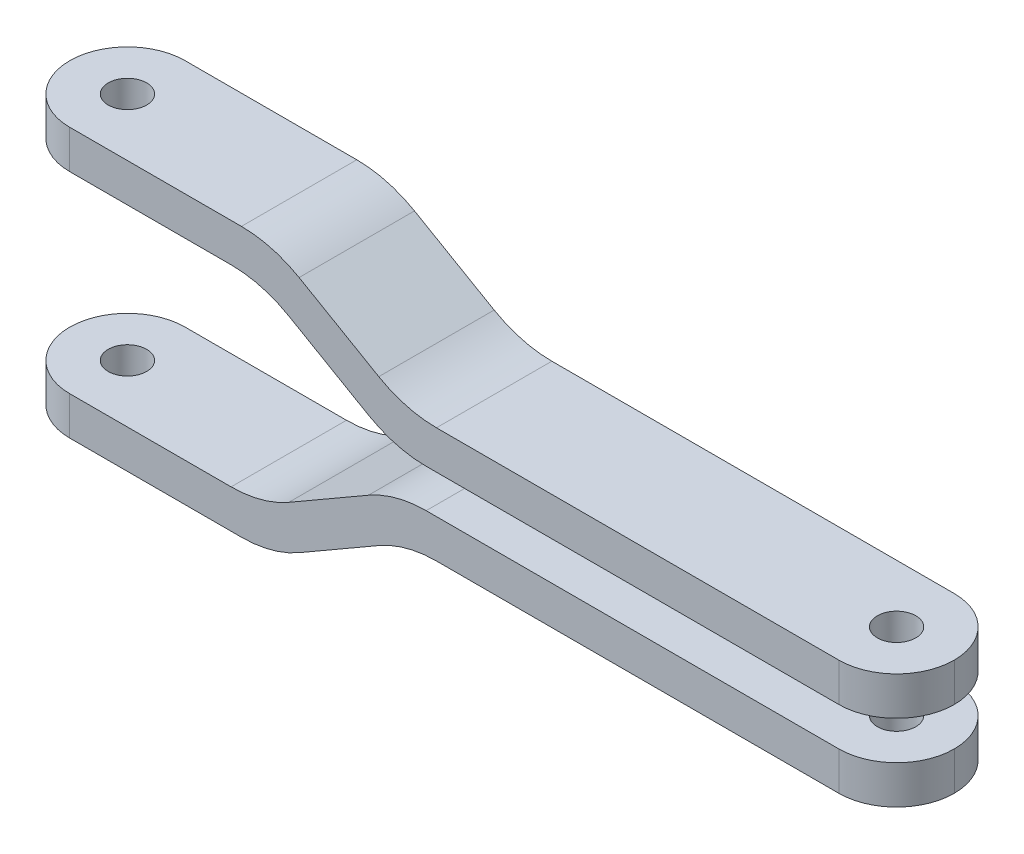
ISO-10303-21;
HEADER;
FILE_DESCRIPTION(('STEP AP214'),'2;1');
FILE_NAME('part.step','',(''),(''),'','','');
FILE_SCHEMA(('AUTOMOTIVE_DESIGN { 1 0 10303 214 1 1 1 1 }'));
ENDSEC;
DATA;
#1=APPLICATION_CONTEXT('core data for automotive mechanical design processes');
#2=APPLICATION_PROTOCOL_DEFINITION('international standard','automotive_design',2000,#1);
#3=PRODUCT_CONTEXT('',#1,'mechanical');
#4=PRODUCT('Part','Part','',(#3));
#5=PRODUCT_RELATED_PRODUCT_CATEGORY('part','',(#4));
#6=PRODUCT_DEFINITION_FORMATION('','',#4);
#7=PRODUCT_DEFINITION_CONTEXT('part definition',#1,'design');
#8=PRODUCT_DEFINITION('design','',#6,#7);
#9=PRODUCT_DEFINITION_SHAPE('','',#8);
#10=(LENGTH_UNIT() NAMED_UNIT(*) SI_UNIT(.MILLI.,.METRE.));
#11=(NAMED_UNIT(*) PLANE_ANGLE_UNIT() SI_UNIT($,.RADIAN.));
#12=(NAMED_UNIT(*) SI_UNIT($,.STERADIAN.) SOLID_ANGLE_UNIT());
#13=UNCERTAINTY_MEASURE_WITH_UNIT(LENGTH_MEASURE(1.E-05),#10,'distance_accuracy_value','');
#14=(GEOMETRIC_REPRESENTATION_CONTEXT(3) GLOBAL_UNCERTAINTY_ASSIGNED_CONTEXT((#13)) GLOBAL_UNIT_ASSIGNED_CONTEXT((#10,
#11,#12)) REPRESENTATION_CONTEXT('',''));
#15=CARTESIAN_POINT('',(0.,0.,0.));
#16=DIRECTION('',(0.,0.,1.));
#17=DIRECTION('',(1.,0.,0.));
#18=AXIS2_PLACEMENT_3D('',#15,#16,#17);
#19=CARTESIAN_POINT('',(-215.,35.,15.));
#20=DIRECTION('',(0.,-1.,0.));
#21=DIRECTION('',(-1.,0.,0.));
#22=AXIS2_PLACEMENT_3D('',#19,#20,#21);
#23=PLANE('',#22);
#24=CARTESIAN_POINT('',(-200.,35.,0.));
#25=DIRECTION('',(0.,1.,0.));
#26=DIRECTION('',(-1.,0.,0.));
#27=AXIS2_PLACEMENT_3D('',#24,#25,#26);
#28=CIRCLE('',#27,4.99999999999999);
#29=CARTESIAN_POINT('',(-205.,35.,0.));
#30=VERTEX_POINT('',#29);
#31=EDGE_CURVE('E301',#30,#30,#28,.F.);
#32=ORIENTED_EDGE('',*,*,#31,.T.);
#33=EDGE_LOOP('',(#32));
#34=FACE_BOUND('',#33,.T.);
#35=DIRECTION('',(1.,0.,0.));
#36=VECTOR('',#35,1.);
#37=CARTESIAN_POINT('',(-215.,35.,-15.));
#38=LINE('',#37,#36);
#39=CARTESIAN_POINT('',(-200.,35.,-15.));
#40=VERTEX_POINT('',#39);
#41=CARTESIAN_POINT('',(-155.358983848622,35.,-15.));
#42=VERTEX_POINT('',#41);
#43=EDGE_CURVE('E188',#40,#42,#38,.T.);
#44=ORIENTED_EDGE('',*,*,#43,.F.);
#45=CARTESIAN_POINT('',(-200.,35.,0.));
#46=DIRECTION('',(0.,1.,0.));
#47=DIRECTION('',(-1.,0.,0.));
#48=AXIS2_PLACEMENT_3D('',#45,#46,#47);
#49=CIRCLE('',#48,15.);
#50=CARTESIAN_POINT('',(-215.,35.,0.));
#51=VERTEX_POINT('',#50);
#52=EDGE_CURVE('E173',#51,#40,#49,.F.);
#53=ORIENTED_EDGE('',*,*,#52,.F.);
#54=CARTESIAN_POINT('',(-200.,35.,0.));
#55=DIRECTION('',(0.,1.,0.));
#56=DIRECTION('',(-1.,0.,0.));
#57=AXIS2_PLACEMENT_3D('',#54,#55,#56);
#58=CIRCLE('',#57,15.);
#59=CARTESIAN_POINT('',(-200.,35.,15.));
#60=VERTEX_POINT('',#59);
#61=EDGE_CURVE('E152',#60,#51,#58,.F.);
#62=ORIENTED_EDGE('',*,*,#61,.F.);
#63=DIRECTION('',(1.,0.,0.));
#64=VECTOR('',#63,1.);
#65=CARTESIAN_POINT('',(-215.,35.,15.));
#66=LINE('',#65,#64);
#67=CARTESIAN_POINT('',(-155.358983848622,35.,15.));
#68=VERTEX_POINT('',#67);
#69=EDGE_CURVE('E161',#60,#68,#66,.T.);
#70=ORIENTED_EDGE('',*,*,#69,.T.);
#71=DIRECTION('',(0.,0.,-1.));
#72=VECTOR('',#71,1.);
#73=CARTESIAN_POINT('',(-155.358983848622,35.,15.));
#74=LINE('',#73,#72);
#75=EDGE_CURVE('E204',#42,#68,#74,.F.);
#76=ORIENTED_EDGE('',*,*,#75,.F.);
#77=EDGE_LOOP('',(#44,#53,#62,#70,#76));
#78=FACE_BOUND('',#77,.T.);
#79=ADVANCED_FACE('F49',(#34,#78),#23,.F.);
#80=CARTESIAN_POINT('',(-147.320508075689,35.,15.));
#81=DIRECTION('',(-0.500000000000001,-0.866025403784438,0.));
#82=DIRECTION('',(-0.866025403784438,0.500000000000002,0.));
#83=AXIS2_PLACEMENT_3D('',#80,#81,#82);
#84=PLANE('',#83);
#85=DIRECTION('',(0.866025403784438,-0.500000000000002,0.));
#86=VECTOR('',#85,1.);
#87=CARTESIAN_POINT('',(-147.320508075689,35.,-15.));
#88=LINE('',#87,#86);
#89=CARTESIAN_POINT('',(-140.358983848622,30.9807621135332,-15.));
#90=VERTEX_POINT('',#89);
#91=CARTESIAN_POINT('',(-119.641016151378,19.0192378864669,-15.));
#92=VERTEX_POINT('',#91);
#93=EDGE_CURVE('E269',#90,#92,#88,.T.);
#94=ORIENTED_EDGE('',*,*,#93,.F.);
#95=DIRECTION('',(0.,0.,-1.));
#96=VECTOR('',#95,1.);
#97=CARTESIAN_POINT('',(-140.358983848622,30.9807621135332,15.));
#98=LINE('',#97,#96);
#99=CARTESIAN_POINT('',(-140.358983848622,30.9807621135332,15.));
#100=VERTEX_POINT('',#99);
#101=EDGE_CURVE('E194',#100,#90,#98,.T.);
#102=ORIENTED_EDGE('',*,*,#101,.F.);
#103=DIRECTION('',(0.866025403784438,-0.500000000000002,0.));
#104=VECTOR('',#103,1.);
#105=CARTESIAN_POINT('',(-147.320508075689,35.,15.));
#106=LINE('',#105,#104);
#107=CARTESIAN_POINT('',(-119.641016151378,19.0192378864669,15.));
#108=VERTEX_POINT('',#107);
#109=EDGE_CURVE('E168',#100,#108,#106,.T.);
#110=ORIENTED_EDGE('',*,*,#109,.T.);
#111=DIRECTION('',(0.,0.,-1.));
#112=VECTOR('',#111,1.);
#113=CARTESIAN_POINT('',(-119.641016151378,19.0192378864669,15.));
#114=LINE('',#113,#112);
#115=EDGE_CURVE('E197',#92,#108,#114,.F.);
#116=ORIENTED_EDGE('',*,*,#115,.F.);
#117=EDGE_LOOP('',(#94,#102,#110,#116));
#118=FACE_BOUND('',#117,.T.);
#119=ADVANCED_FACE('F318',(#118),#84,.F.);
#120=CARTESIAN_POINT('',(-112.679491924311,15.,15.));
#121=DIRECTION('',(0.,-1.,0.));
#122=DIRECTION('',(-1.,0.,0.));
#123=AXIS2_PLACEMENT_3D('',#120,#121,#122);
#124=PLANE('',#123);
#125=CARTESIAN_POINT('',(0.,15.,0.));
#126=DIRECTION('',(0.,1.,0.));
#127=DIRECTION('',(-1.,0.,0.));
#128=AXIS2_PLACEMENT_3D('',#125,#126,#127);
#129=CIRCLE('',#128,5.);
#130=CARTESIAN_POINT('',(-5.,15.,0.));
#131=VERTEX_POINT('',#130);
#132=EDGE_CURVE('E191',#131,#131,#129,.F.);
#133=ORIENTED_EDGE('',*,*,#132,.T.);
#134=EDGE_LOOP('',(#133));
#135=FACE_BOUND('',#134,.T.);
#136=DIRECTION('',(1.,0.,0.));
#137=VECTOR('',#136,1.);
#138=CARTESIAN_POINT('',(-112.679491924311,15.,15.));
#139=LINE('',#138,#137);
#140=CARTESIAN_POINT('',(-104.641016151378,15.,15.));
#141=VERTEX_POINT('',#140);
#142=CARTESIAN_POINT('',(0.,15.,15.));
#143=VERTEX_POINT('',#142);
#144=EDGE_CURVE('E290',#141,#143,#139,.T.);
#145=ORIENTED_EDGE('',*,*,#144,.T.);
#146=CARTESIAN_POINT('',(0.,15.,0.));
#147=DIRECTION('',(0.,1.,0.));
#148=DIRECTION('',(-1.,0.,0.));
#149=AXIS2_PLACEMENT_3D('',#146,#147,#148);
#150=CIRCLE('',#149,15.);
#151=CARTESIAN_POINT('',(15.,15.,0.));
#152=VERTEX_POINT('',#151);
#153=EDGE_CURVE('E255',#152,#143,#150,.F.);
#154=ORIENTED_EDGE('',*,*,#153,.F.);
#155=CARTESIAN_POINT('',(0.,15.,0.));
#156=DIRECTION('',(0.,1.,0.));
#157=DIRECTION('',(-1.,0.,0.));
#158=AXIS2_PLACEMENT_3D('',#155,#156,#157);
#159=CIRCLE('',#158,15.);
#160=CARTESIAN_POINT('',(0.,15.,-15.));
#161=VERTEX_POINT('',#160);
#162=EDGE_CURVE('E252',#161,#152,#159,.F.);
#163=ORIENTED_EDGE('',*,*,#162,.F.);
#164=DIRECTION('',(1.,0.,0.));
#165=VECTOR('',#164,1.);
#166=CARTESIAN_POINT('',(-112.679491924311,15.,-15.));
#167=LINE('',#166,#165);
#168=CARTESIAN_POINT('',(-104.641016151378,15.,-15.));
#169=VERTEX_POINT('',#168);
#170=EDGE_CURVE('E241',#169,#161,#167,.T.);
#171=ORIENTED_EDGE('',*,*,#170,.F.);
#172=DIRECTION('',(0.,0.,-1.));
#173=VECTOR('',#172,1.);
#174=CARTESIAN_POINT('',(-104.641016151378,15.,-15.));
#175=LINE('',#174,#173);
#176=EDGE_CURVE('E185',#141,#169,#175,.T.);
#177=ORIENTED_EDGE('',*,*,#176,.F.);
#178=EDGE_LOOP('',(#145,#154,#163,#171,#177));
#179=FACE_BOUND('',#178,.T.);
#180=ADVANCED_FACE('F277',(#135,#179),#124,.F.);
#181=CARTESIAN_POINT('',(-115.358983848622,5.00000000000003,15.));
#182=DIRECTION('',(0.,1.,0.));
#183=DIRECTION('',(1.,0.,0.));
#184=AXIS2_PLACEMENT_3D('',#181,#182,#183);
#185=PLANE('',#184);
#186=CARTESIAN_POINT('',(0.,5.00000000000002,0.));
#187=DIRECTION('',(0.,-1.,0.));
#188=DIRECTION('',(1.,0.,0.));
#189=AXIS2_PLACEMENT_3D('',#186,#187,#188);
#190=CIRCLE('',#189,5.);
#191=CARTESIAN_POINT('',(5.,5.00000000000001,0.));
#192=VERTEX_POINT('',#191);
#193=EDGE_CURVE('E300',#192,#192,#190,.F.);
#194=ORIENTED_EDGE('',*,*,#193,.T.);
#195=EDGE_LOOP('',(#194));
#196=FACE_BOUND('',#195,.T.);
#197=DIRECTION('',(-1.,0.,0.));
#198=VECTOR('',#197,1.);
#199=CARTESIAN_POINT('',(-115.358983848622,5.00000000000003,-15.));
#200=LINE('',#199,#198);
#201=CARTESIAN_POINT('',(0.,5.00000000000001,-15.));
#202=VERTEX_POINT('',#201);
#203=CARTESIAN_POINT('',(-107.320508075689,5.00000000000003,-15.));
#204=VERTEX_POINT('',#203);
#205=EDGE_CURVE('E238',#202,#204,#200,.T.);
#206=ORIENTED_EDGE('',*,*,#205,.F.);
#207=CARTESIAN_POINT('',(0.,5.00000000000001,0.));
#208=DIRECTION('',(0.,-1.,0.));
#209=DIRECTION('',(1.,0.,0.));
#210=AXIS2_PLACEMENT_3D('',#207,#208,#209);
#211=CIRCLE('',#210,15.);
#212=CARTESIAN_POINT('',(15.,5.00000000000001,0.));
#213=VERTEX_POINT('',#212);
#214=EDGE_CURVE('E246',#213,#202,#211,.F.);
#215=ORIENTED_EDGE('',*,*,#214,.F.);
#216=CARTESIAN_POINT('',(0.,5.00000000000001,0.));
#217=DIRECTION('',(0.,-1.,0.));
#218=DIRECTION('',(1.,0.,0.));
#219=AXIS2_PLACEMENT_3D('',#216,#217,#218);
#220=CIRCLE('',#219,15.);
#221=CARTESIAN_POINT('',(0.,5.00000000000001,15.));
#222=VERTEX_POINT('',#221);
#223=EDGE_CURVE('E249',#222,#213,#220,.F.);
#224=ORIENTED_EDGE('',*,*,#223,.F.);
#225=DIRECTION('',(-1.,0.,0.));
#226=VECTOR('',#225,1.);
#227=CARTESIAN_POINT('',(-115.358983848622,5.00000000000003,15.));
#228=LINE('',#227,#226);
#229=CARTESIAN_POINT('',(-107.320508075689,5.00000000000003,15.));
#230=VERTEX_POINT('',#229);
#231=EDGE_CURVE('E264',#222,#230,#228,.T.);
#232=ORIENTED_EDGE('',*,*,#231,.T.);
#233=DIRECTION('',(0.,0.,-1.));
#234=VECTOR('',#233,1.);
#235=CARTESIAN_POINT('',(-107.320508075689,5.00000000000003,15.));
#236=LINE('',#235,#234);
#237=EDGE_CURVE('E216',#204,#230,#236,.F.);
#238=ORIENTED_EDGE('',*,*,#237,.F.);
#239=EDGE_LOOP('',(#206,#215,#224,#232,#238));
#240=FACE_BOUND('',#239,.T.);
#241=ADVANCED_FACE('F285',(#196,#240),#185,.F.);
#242=CARTESIAN_POINT('',(-150.,25.,15.));
#243=DIRECTION('',(0.500000000000001,0.866025403784438,0.));
#244=DIRECTION('',(0.866025403784438,-0.500000000000001,0.));
#245=AXIS2_PLACEMENT_3D('',#242,#243,#244);
#246=PLANE('',#245);
#247=DIRECTION('',(-0.866025403784438,0.500000000000001,0.));
#248=VECTOR('',#247,1.);
#249=CARTESIAN_POINT('',(-150.,25.,-15.));
#250=LINE('',#249,#248);
#251=CARTESIAN_POINT('',(-122.320508075689,9.01923788646689,-15.));
#252=VERTEX_POINT('',#251);
#253=CARTESIAN_POINT('',(-143.038475772934,20.9807621135332,-15.));
#254=VERTEX_POINT('',#253);
#255=EDGE_CURVE('E233',#252,#254,#250,.T.);
#256=ORIENTED_EDGE('',*,*,#255,.F.);
#257=DIRECTION('',(0.,0.,-1.));
#258=VECTOR('',#257,1.);
#259=CARTESIAN_POINT('',(-122.320508075689,9.01923788646689,15.));
#260=LINE('',#259,#258);
#261=CARTESIAN_POINT('',(-122.320508075689,9.01923788646689,15.));
#262=VERTEX_POINT('',#261);
#263=EDGE_CURVE('E211',#262,#252,#260,.T.);
#264=ORIENTED_EDGE('',*,*,#263,.F.);
#265=DIRECTION('',(-0.866025403784438,0.500000000000001,0.));
#266=VECTOR('',#265,1.);
#267=CARTESIAN_POINT('',(-150.,25.,15.));
#268=LINE('',#267,#266);
#269=CARTESIAN_POINT('',(-143.038475772934,20.9807621135332,15.));
#270=VERTEX_POINT('',#269);
#271=EDGE_CURVE('E234',#262,#270,#268,.T.);
#272=ORIENTED_EDGE('',*,*,#271,.T.);
#273=DIRECTION('',(0.,0.,-1.));
#274=VECTOR('',#273,1.);
#275=CARTESIAN_POINT('',(-143.038475772934,20.9807621135332,15.));
#276=LINE('',#275,#274);
#277=EDGE_CURVE('E214',#254,#270,#276,.F.);
#278=ORIENTED_EDGE('',*,*,#277,.F.);
#279=EDGE_LOOP('',(#256,#264,#272,#278));
#280=FACE_BOUND('',#279,.T.);
#281=ADVANCED_FACE('F231',(#280),#246,.F.);
#282=CARTESIAN_POINT('',(-215.,25.0000000000001,15.));
#283=DIRECTION('',(0.,1.,0.));
#284=DIRECTION('',(1.,0.,0.));
#285=AXIS2_PLACEMENT_3D('',#282,#283,#284);
#286=PLANE('',#285);
#287=CARTESIAN_POINT('',(-200.,25.,0.));
#288=DIRECTION('',(0.,-1.,0.));
#289=DIRECTION('',(1.,0.,0.));
#290=AXIS2_PLACEMENT_3D('',#287,#288,#289);
#291=CIRCLE('',#290,4.99999999999999);
#292=CARTESIAN_POINT('',(-195.,25.,0.));
#293=VERTEX_POINT('',#292);
#294=EDGE_CURVE('E297',#293,#293,#291,.F.);
#295=ORIENTED_EDGE('',*,*,#294,.T.);
#296=EDGE_LOOP('',(#295));
#297=FACE_BOUND('',#296,.T.);
#298=DIRECTION('',(-1.,0.,0.));
#299=VECTOR('',#298,1.);
#300=CARTESIAN_POINT('',(-215.,25.0000000000001,15.));
#301=LINE('',#300,#299);
#302=CARTESIAN_POINT('',(-158.038475772934,25.,15.));
#303=VERTEX_POINT('',#302);
#304=CARTESIAN_POINT('',(-200.,25.0000000000001,15.));
#305=VERTEX_POINT('',#304);
#306=EDGE_CURVE('E158',#303,#305,#301,.T.);
#307=ORIENTED_EDGE('',*,*,#306,.T.);
#308=CARTESIAN_POINT('',(-200.,25.0000000000001,0.));
#309=DIRECTION('',(0.,-1.,0.));
#310=DIRECTION('',(1.,0.,0.));
#311=AXIS2_PLACEMENT_3D('',#308,#309,#310);
#312=CIRCLE('',#311,15.);
#313=CARTESIAN_POINT('',(-215.,25.0000000000001,0.));
#314=VERTEX_POINT('',#313);
#315=EDGE_CURVE('E155',#314,#305,#312,.F.);
#316=ORIENTED_EDGE('',*,*,#315,.F.);
#317=CARTESIAN_POINT('',(-200.,25.0000000000001,0.));
#318=DIRECTION('',(0.,-1.,0.));
#319=DIRECTION('',(1.,0.,0.));
#320=AXIS2_PLACEMENT_3D('',#317,#318,#319);
#321=CIRCLE('',#320,15.);
#322=CARTESIAN_POINT('',(-200.,25.0000000000001,-15.));
#323=VERTEX_POINT('',#322);
#324=EDGE_CURVE('E182',#323,#314,#321,.F.);
#325=ORIENTED_EDGE('',*,*,#324,.F.);
#326=DIRECTION('',(-1.,0.,0.));
#327=VECTOR('',#326,1.);
#328=CARTESIAN_POINT('',(-215.,25.0000000000001,-15.));
#329=LINE('',#328,#327);
#330=CARTESIAN_POINT('',(-158.038475772934,25.,-15.));
#331=VERTEX_POINT('',#330);
#332=EDGE_CURVE('E169',#331,#323,#329,.T.);
#333=ORIENTED_EDGE('',*,*,#332,.F.);
#334=DIRECTION('',(0.,0.,-1.));
#335=VECTOR('',#334,1.);
#336=CARTESIAN_POINT('',(-158.038475772934,25.,-15.));
#337=LINE('',#336,#335);
#338=EDGE_CURVE('E209',#303,#331,#337,.T.);
#339=ORIENTED_EDGE('',*,*,#338,.F.);
#340=EDGE_LOOP('',(#307,#316,#325,#333,#339));
#341=FACE_BOUND('',#340,.T.);
#342=ADVANCED_FACE('F262',(#297,#341),#286,.F.);
#343=CARTESIAN_POINT('',(0.,0.,15.));
#344=DIRECTION('',(0.,0.,1.));
#345=DIRECTION('',(1.,0.,0.));
#346=AXIS2_PLACEMENT_3D('',#343,#344,#345);
#347=PLANE('',#346);
#348=ORIENTED_EDGE('',*,*,#69,.F.);
#349=DIRECTION('',(0.,1.,0.));
#350=VECTOR('',#349,1.);
#351=CARTESIAN_POINT('',(-200.,35.,15.));
#352=LINE('',#351,#350);
#353=EDGE_CURVE('E148',#305,#60,#352,.T.);
#354=ORIENTED_EDGE('',*,*,#353,.F.);
#355=ORIENTED_EDGE('',*,*,#306,.F.);
#356=CARTESIAN_POINT('',(-158.038475772934,-4.99999999999995,15.));
#357=DIRECTION('',(0.,0.,-1.));
#358=DIRECTION('',(1.,0.,0.));
#359=AXIS2_PLACEMENT_3D('',#356,#357,#358);
#360=CIRCLE('',#359,30.);
#361=EDGE_CURVE('E12',#270,#303,#360,.F.);
#362=ORIENTED_EDGE('',*,*,#361,.F.);
#363=ORIENTED_EDGE('',*,*,#271,.F.);
#364=CARTESIAN_POINT('',(-107.320508075689,35.,15.));
#365=DIRECTION('',(0.,0.,-1.));
#366=DIRECTION('',(1.,0.,0.));
#367=AXIS2_PLACEMENT_3D('',#364,#365,#366);
#368=CIRCLE('',#367,30.);
#369=EDGE_CURVE('E206',#230,#262,#368,.T.);
#370=ORIENTED_EDGE('',*,*,#369,.F.);
#371=ORIENTED_EDGE('',*,*,#231,.F.);
#372=DIRECTION('',(0.,-1.,0.));
#373=VECTOR('',#372,1.);
#374=CARTESIAN_POINT('',(0.,5.00000000000001,15.));
#375=LINE('',#374,#373);
#376=EDGE_CURVE('E157',#143,#222,#375,.T.);
#377=ORIENTED_EDGE('',*,*,#376,.F.);
#378=ORIENTED_EDGE('',*,*,#144,.F.);
#379=CARTESIAN_POINT('',(-104.641016151378,45.,15.));
#380=DIRECTION('',(0.,0.,-1.));
#381=DIRECTION('',(1.,0.,0.));
#382=AXIS2_PLACEMENT_3D('',#379,#380,#381);
#383=CIRCLE('',#382,30.);
#384=EDGE_CURVE('E221',#108,#141,#383,.F.);
#385=ORIENTED_EDGE('',*,*,#384,.F.);
#386=ORIENTED_EDGE('',*,*,#109,.F.);
#387=CARTESIAN_POINT('',(-155.358983848622,5.00000000000005,15.));
#388=DIRECTION('',(0.,0.,-1.));
#389=DIRECTION('',(1.,0.,0.));
#390=AXIS2_PLACEMENT_3D('',#387,#388,#389);
#391=CIRCLE('',#390,30.);
#392=EDGE_CURVE('E164',#68,#100,#391,.T.);
#393=ORIENTED_EDGE('',*,*,#392,.F.);
#394=EDGE_LOOP('',(#348,#354,#355,#362,#363,#370,#371,#377,#378,#385,#386,#393));
#395=FACE_BOUND('',#394,.T.);
#396=ADVANCED_FACE('F162',(#395),#347,.T.);
#397=CARTESIAN_POINT('',(0.,0.,-15.));
#398=DIRECTION('',(0.,0.,1.));
#399=DIRECTION('',(1.,0.,0.));
#400=AXIS2_PLACEMENT_3D('',#397,#398,#399);
#401=PLANE('',#400);
#402=ORIENTED_EDGE('',*,*,#93,.T.);
#403=CARTESIAN_POINT('',(-104.641016151378,45.,-15.));
#404=DIRECTION('',(0.,0.,-1.));
#405=DIRECTION('',(1.,0.,0.));
#406=AXIS2_PLACEMENT_3D('',#403,#404,#405);
#407=CIRCLE('',#406,30.);
#408=EDGE_CURVE('E219',#169,#92,#407,.T.);
#409=ORIENTED_EDGE('',*,*,#408,.F.);
#410=ORIENTED_EDGE('',*,*,#170,.T.);
#411=DIRECTION('',(0.,-1.,0.));
#412=VECTOR('',#411,1.);
#413=CARTESIAN_POINT('',(0.,0.,-15.));
#414=LINE('',#413,#412);
#415=EDGE_CURVE('E174',#202,#161,#414,.F.);
#416=ORIENTED_EDGE('',*,*,#415,.F.);
#417=ORIENTED_EDGE('',*,*,#205,.T.);
#418=CARTESIAN_POINT('',(-107.320508075689,35.,-15.));
#419=DIRECTION('',(0.,0.,-1.));
#420=DIRECTION('',(1.,0.,0.));
#421=AXIS2_PLACEMENT_3D('',#418,#419,#420);
#422=CIRCLE('',#421,30.);
#423=EDGE_CURVE('E200',#252,#204,#422,.F.);
#424=ORIENTED_EDGE('',*,*,#423,.F.);
#425=ORIENTED_EDGE('',*,*,#255,.T.);
#426=CARTESIAN_POINT('',(-158.038475772934,-4.99999999999995,-15.));
#427=DIRECTION('',(0.,0.,-1.));
#428=DIRECTION('',(1.,0.,0.));
#429=AXIS2_PLACEMENT_3D('',#426,#427,#428);
#430=CIRCLE('',#429,30.);
#431=EDGE_CURVE('E57',#331,#254,#430,.T.);
#432=ORIENTED_EDGE('',*,*,#431,.F.);
#433=ORIENTED_EDGE('',*,*,#332,.T.);
#434=DIRECTION('',(0.,1.,0.));
#435=VECTOR('',#434,1.);
#436=CARTESIAN_POINT('',(-200.,0.,-15.));
#437=LINE('',#436,#435);
#438=EDGE_CURVE('E177',#40,#323,#437,.F.);
#439=ORIENTED_EDGE('',*,*,#438,.F.);
#440=ORIENTED_EDGE('',*,*,#43,.T.);
#441=CARTESIAN_POINT('',(-155.358983848622,5.00000000000005,-15.));
#442=DIRECTION('',(0.,0.,-1.));
#443=DIRECTION('',(1.,0.,0.));
#444=AXIS2_PLACEMENT_3D('',#441,#442,#443);
#445=CIRCLE('',#444,30.);
#446=EDGE_CURVE('E202',#90,#42,#445,.F.);
#447=ORIENTED_EDGE('',*,*,#446,.F.);
#448=EDGE_LOOP('',(#402,#409,#410,#416,#417,#424,#425,#432,#433,#439,#440,#447));
#449=FACE_BOUND('',#448,.T.);
#450=ADVANCED_FACE('F236',(#449),#401,.F.);
#451=CARTESIAN_POINT('',(0.,5.00000000000001,0.));
#452=DIRECTION('',(0.,-1.,0.));
#453=DIRECTION('',(-1.,0.,0.));
#454=AXIS2_PLACEMENT_3D('',#451,#452,#453);
#455=CYLINDRICAL_SURFACE('',#454,15.);
#456=DIRECTION('',(0.,-1.,0.));
#457=VECTOR('',#456,1.);
#458=CARTESIAN_POINT('',(15.,5.00000000000001,0.));
#459=LINE('',#458,#457);
#460=EDGE_CURVE('E186',#152,#213,#459,.T.);
#461=ORIENTED_EDGE('',*,*,#460,.T.);
#462=ORIENTED_EDGE('',*,*,#214,.T.);
#463=ORIENTED_EDGE('',*,*,#415,.T.);
#464=ORIENTED_EDGE('',*,*,#162,.T.);
#465=EDGE_LOOP('',(#461,#462,#463,#464));
#466=FACE_BOUND('',#465,.T.);
#467=ADVANCED_FACE('F279',(#466),#455,.T.);
#468=CARTESIAN_POINT('',(0.,0.,0.));
#469=DIRECTION('',(0.,1.,0.));
#470=DIRECTION('',(1.,0.,0.));
#471=AXIS2_PLACEMENT_3D('',#468,#469,#470);
#472=CYLINDRICAL_SURFACE('',#471,15.);
#473=ORIENTED_EDGE('',*,*,#153,.T.);
#474=ORIENTED_EDGE('',*,*,#376,.T.);
#475=ORIENTED_EDGE('',*,*,#223,.T.);
#476=ORIENTED_EDGE('',*,*,#460,.F.);
#477=EDGE_LOOP('',(#473,#474,#475,#476));
#478=FACE_BOUND('',#477,.T.);
#479=ADVANCED_FACE('F292',(#478),#472,.T.);
#480=CARTESIAN_POINT('',(-200.,0.,0.));
#481=DIRECTION('',(0.,-1.,0.));
#482=DIRECTION('',(0.,0.,1.));
#483=AXIS2_PLACEMENT_3D('',#480,#481,#482);
#484=CYLINDRICAL_SURFACE('',#483,15.);
#485=ORIENTED_EDGE('',*,*,#353,.T.);
#486=ORIENTED_EDGE('',*,*,#61,.T.);
#487=DIRECTION('',(0.,1.,0.));
#488=VECTOR('',#487,1.);
#489=CARTESIAN_POINT('',(-215.,25.0000000000001,0.));
#490=LINE('',#489,#488);
#491=EDGE_CURVE('E189',#51,#314,#490,.F.);
#492=ORIENTED_EDGE('',*,*,#491,.T.);
#493=ORIENTED_EDGE('',*,*,#315,.T.);
#494=EDGE_LOOP('',(#485,#486,#492,#493));
#495=FACE_BOUND('',#494,.T.);
#496=ADVANCED_FACE('F150',(#495),#484,.T.);
#497=CARTESIAN_POINT('',(-200.,25.0000000000001,0.));
#498=DIRECTION('',(0.,1.,0.));
#499=DIRECTION('',(0.,0.,-1.));
#500=AXIS2_PLACEMENT_3D('',#497,#498,#499);
#501=CYLINDRICAL_SURFACE('',#500,15.);
#502=ORIENTED_EDGE('',*,*,#324,.T.);
#503=ORIENTED_EDGE('',*,*,#491,.F.);
#504=ORIENTED_EDGE('',*,*,#52,.T.);
#505=ORIENTED_EDGE('',*,*,#438,.T.);
#506=EDGE_LOOP('',(#502,#503,#504,#505));
#507=FACE_BOUND('',#506,.T.);
#508=ADVANCED_FACE('F258',(#507),#501,.T.);
#509=CARTESIAN_POINT('',(-104.641016151378,45.,15.));
#510=DIRECTION('',(0.,0.,1.));
#511=DIRECTION('',(1.,0.,0.));
#512=AXIS2_PLACEMENT_3D('',#509,#510,#511);
#513=CYLINDRICAL_SURFACE('',#512,30.);
#514=ORIENTED_EDGE('',*,*,#384,.T.);
#515=ORIENTED_EDGE('',*,*,#176,.T.);
#516=ORIENTED_EDGE('',*,*,#408,.T.);
#517=ORIENTED_EDGE('',*,*,#115,.T.);
#518=EDGE_LOOP('',(#514,#515,#516,#517));
#519=FACE_BOUND('',#518,.T.);
#520=ADVANCED_FACE('F339',(#519),#513,.F.);
#521=CARTESIAN_POINT('',(-155.358983848622,5.00000000000005,15.));
#522=DIRECTION('',(0.,0.,-1.));
#523=DIRECTION('',(-1.,0.,0.));
#524=AXIS2_PLACEMENT_3D('',#521,#522,#523);
#525=CYLINDRICAL_SURFACE('',#524,30.);
#526=ORIENTED_EDGE('',*,*,#392,.T.);
#527=ORIENTED_EDGE('',*,*,#101,.T.);
#528=ORIENTED_EDGE('',*,*,#446,.T.);
#529=ORIENTED_EDGE('',*,*,#75,.T.);
#530=EDGE_LOOP('',(#526,#527,#528,#529));
#531=FACE_BOUND('',#530,.T.);
#532=ADVANCED_FACE('F344',(#531),#525,.T.);
#533=CARTESIAN_POINT('',(-158.038475772934,-4.99999999999995,15.));
#534=DIRECTION('',(0.,0.,1.));
#535=DIRECTION('',(1.,0.,0.));
#536=AXIS2_PLACEMENT_3D('',#533,#534,#535);
#537=CYLINDRICAL_SURFACE('',#536,30.);
#538=ORIENTED_EDGE('',*,*,#361,.T.);
#539=ORIENTED_EDGE('',*,*,#338,.T.);
#540=ORIENTED_EDGE('',*,*,#431,.T.);
#541=ORIENTED_EDGE('',*,*,#277,.T.);
#542=EDGE_LOOP('',(#538,#539,#540,#541));
#543=FACE_BOUND('',#542,.T.);
#544=ADVANCED_FACE('F223',(#543),#537,.F.);
#545=CARTESIAN_POINT('',(-107.320508075689,35.,15.));
#546=DIRECTION('',(0.,0.,-1.));
#547=DIRECTION('',(-1.,0.,0.));
#548=AXIS2_PLACEMENT_3D('',#545,#546,#547);
#549=CYLINDRICAL_SURFACE('',#548,30.);
#550=ORIENTED_EDGE('',*,*,#369,.T.);
#551=ORIENTED_EDGE('',*,*,#263,.T.);
#552=ORIENTED_EDGE('',*,*,#423,.T.);
#553=ORIENTED_EDGE('',*,*,#237,.T.);
#554=EDGE_LOOP('',(#550,#551,#552,#553));
#555=FACE_BOUND('',#554,.T.);
#556=ADVANCED_FACE('F51',(#555),#549,.T.);
#557=CARTESIAN_POINT('',(-200.,35.0010000000001,0.));
#558=DIRECTION('',(0.,-1.,0.));
#559=DIRECTION('',(0.,0.,1.));
#560=AXIS2_PLACEMENT_3D('',#557,#558,#559);
#561=CYLINDRICAL_SURFACE('',#560,4.99999999999999);
#562=ORIENTED_EDGE('',*,*,#294,.F.);
#563=EDGE_LOOP('',(#562));
#564=FACE_BOUND('',#563,.T.);
#565=ORIENTED_EDGE('',*,*,#31,.F.);
#566=EDGE_LOOP('',(#565));
#567=FACE_BOUND('',#566,.T.);
#568=ADVANCED_FACE('F313',(#564,#567),#561,.F.);
#569=CARTESIAN_POINT('',(0.,35.0010000000001,0.));
#570=DIRECTION('',(0.,-1.,0.));
#571=DIRECTION('',(0.,0.,1.));
#572=AXIS2_PLACEMENT_3D('',#569,#570,#571);
#573=CYLINDRICAL_SURFACE('',#572,5.);
#574=ORIENTED_EDGE('',*,*,#193,.F.);
#575=EDGE_LOOP('',(#574));
#576=FACE_BOUND('',#575,.T.);
#577=ORIENTED_EDGE('',*,*,#132,.F.);
#578=EDGE_LOOP('',(#577));
#579=FACE_BOUND('',#578,.T.);
#580=ADVANCED_FACE('F310',(#576,#579),#573,.F.);
#581=CLOSED_SHELL('',(#79,#119,#180,#241,#281,#342,#396,#450,#467,#479,#496,#508,#520,#532,#544,
#556,#568,#580));
#582=MANIFOLD_SOLID_BREP('B2',#581);
#583=CARTESIAN_POINT('',(-215.,-35.,15.));
#584=DIRECTION('',(0.,1.,0.));
#585=DIRECTION('',(-1.,0.,0.));
#586=AXIS2_PLACEMENT_3D('',#583,#584,#585);
#587=PLANE('',#586);
#588=CARTESIAN_POINT('',(-200.,-35.,0.));
#589=DIRECTION('',(0.,1.,0.));
#590=DIRECTION('',(-1.,0.,0.));
#591=AXIS2_PLACEMENT_3D('',#588,#589,#590);
#592=CIRCLE('',#591,4.99999999999999);
#593=CARTESIAN_POINT('',(-205.,-35.,0.));
#594=VERTEX_POINT('',#593);
#595=EDGE_CURVE('E889',#594,#594,#592,.F.);
#596=ORIENTED_EDGE('',*,*,#595,.F.);
#597=EDGE_LOOP('',(#596));
#598=FACE_BOUND('',#597,.T.);
#599=DIRECTION('',(1.,0.,0.));
#600=VECTOR('',#599,1.);
#601=CARTESIAN_POINT('',(-215.,-35.,-15.));
#602=LINE('',#601,#600);
#603=CARTESIAN_POINT('',(-200.,-35.,-15.));
#604=VERTEX_POINT('',#603);
#605=CARTESIAN_POINT('',(-155.358983848622,-35.,-15.));
#606=VERTEX_POINT('',#605);
#607=EDGE_CURVE('E617',#604,#606,#602,.T.);
#608=ORIENTED_EDGE('',*,*,#607,.T.);
#609=DIRECTION('',(0.,0.,-1.));
#610=VECTOR('',#609,1.);
#611=CARTESIAN_POINT('',(-155.358983848622,-35.,15.));
#612=LINE('',#611,#610);
#613=CARTESIAN_POINT('',(-155.358983848622,-35.,15.));
#614=VERTEX_POINT('',#613);
#615=EDGE_CURVE('E592',#606,#614,#612,.F.);
#616=ORIENTED_EDGE('',*,*,#615,.T.);
#617=DIRECTION('',(1.,0.,0.));
#618=VECTOR('',#617,1.);
#619=CARTESIAN_POINT('',(-215.,-35.,15.));
#620=LINE('',#619,#618);
#621=CARTESIAN_POINT('',(-200.,-35.,15.));
#622=VERTEX_POINT('',#621);
#623=EDGE_CURVE('E578',#622,#614,#620,.T.);
#624=ORIENTED_EDGE('',*,*,#623,.F.);
#625=CARTESIAN_POINT('',(-200.,-35.,0.));
#626=DIRECTION('',(0.,1.,0.));
#627=DIRECTION('',(-1.,0.,0.));
#628=AXIS2_PLACEMENT_3D('',#625,#626,#627);
#629=CIRCLE('',#628,15.);
#630=CARTESIAN_POINT('',(-215.,-35.,0.));
#631=VERTEX_POINT('',#630);
#632=EDGE_CURVE('E589',#622,#631,#629,.F.);
#633=ORIENTED_EDGE('',*,*,#632,.T.);
#634=CARTESIAN_POINT('',(-200.,-35.,0.));
#635=DIRECTION('',(0.,1.,0.));
#636=DIRECTION('',(-1.,0.,0.));
#637=AXIS2_PLACEMENT_3D('',#634,#635,#636);
#638=CIRCLE('',#637,15.);
#639=EDGE_CURVE('E600',#631,#604,#638,.F.);
#640=ORIENTED_EDGE('',*,*,#639,.T.);
#641=EDGE_LOOP('',(#608,#616,#624,#633,#640));
#642=FACE_BOUND('',#641,.T.);
#643=ADVANCED_FACE('F475',(#598,#642),#587,.F.);
#644=CARTESIAN_POINT('',(-147.320508075689,-35.,15.));
#645=DIRECTION('',(-0.500000000000001,0.866025403784438,0.));
#646=DIRECTION('',(-0.866025403784438,-0.500000000000002,0.));
#647=AXIS2_PLACEMENT_3D('',#644,#645,#646);
#648=PLANE('',#647);
#649=DIRECTION('',(0.866025403784438,0.500000000000002,0.));
#650=VECTOR('',#649,1.);
#651=CARTESIAN_POINT('',(-147.320508075689,-35.,-15.));
#652=LINE('',#651,#650);
#653=CARTESIAN_POINT('',(-140.358983848622,-30.9807621135332,-15.));
#654=VERTEX_POINT('',#653);
#655=CARTESIAN_POINT('',(-119.641016151378,-19.0192378864669,-15.));
#656=VERTEX_POINT('',#655);
#657=EDGE_CURVE('E672',#654,#656,#652,.T.);
#658=ORIENTED_EDGE('',*,*,#657,.T.);
#659=DIRECTION('',(0.,0.,-1.));
#660=VECTOR('',#659,1.);
#661=CARTESIAN_POINT('',(-119.641016151378,-19.0192378864669,15.));
#662=LINE('',#661,#660);
#663=CARTESIAN_POINT('',(-119.641016151378,-19.0192378864669,15.));
#664=VERTEX_POINT('',#663);
#665=EDGE_CURVE('E625',#656,#664,#662,.F.);
#666=ORIENTED_EDGE('',*,*,#665,.T.);
#667=DIRECTION('',(0.866025403784438,0.500000000000002,0.));
#668=VECTOR('',#667,1.);
#669=CARTESIAN_POINT('',(-147.320508075689,-35.,15.));
#670=LINE('',#669,#668);
#671=CARTESIAN_POINT('',(-140.358983848622,-30.9807621135332,15.));
#672=VERTEX_POINT('',#671);
#673=EDGE_CURVE('E593',#672,#664,#670,.T.);
#674=ORIENTED_EDGE('',*,*,#673,.F.);
#675=DIRECTION('',(0.,0.,-1.));
#676=VECTOR('',#675,1.);
#677=CARTESIAN_POINT('',(-140.358983848622,-30.9807621135332,15.));
#678=LINE('',#677,#676);
#679=EDGE_CURVE('E622',#672,#654,#678,.T.);
#680=ORIENTED_EDGE('',*,*,#679,.T.);
#681=EDGE_LOOP('',(#658,#666,#674,#680));
#682=FACE_BOUND('',#681,.T.);
#683=ADVANCED_FACE('F701',(#682),#648,.F.);
#684=CARTESIAN_POINT('',(-112.679491924311,-15.,15.));
#685=DIRECTION('',(0.,1.,0.));
#686=DIRECTION('',(-1.,0.,0.));
#687=AXIS2_PLACEMENT_3D('',#684,#685,#686);
#688=PLANE('',#687);
#689=CARTESIAN_POINT('',(0.,-15.,0.));
#690=DIRECTION('',(0.,1.,0.));
#691=DIRECTION('',(-1.,0.,0.));
#692=AXIS2_PLACEMENT_3D('',#689,#690,#691);
#693=CIRCLE('',#692,5.);
#694=CARTESIAN_POINT('',(-5.,-15.,0.));
#695=VERTEX_POINT('',#694);
#696=EDGE_CURVE('E619',#695,#695,#693,.F.);
#697=ORIENTED_EDGE('',*,*,#696,.F.);
#698=EDGE_LOOP('',(#697));
#699=FACE_BOUND('',#698,.T.);
#700=DIRECTION('',(1.,0.,0.));
#701=VECTOR('',#700,1.);
#702=CARTESIAN_POINT('',(-112.679491924311,-15.,15.));
#703=LINE('',#702,#701);
#704=CARTESIAN_POINT('',(-104.641016151378,-15.,15.));
#705=VERTEX_POINT('',#704);
#706=CARTESIAN_POINT('',(0.,-15.,15.));
#707=VERTEX_POINT('',#706);
#708=EDGE_CURVE('E703',#705,#707,#703,.T.);
#709=ORIENTED_EDGE('',*,*,#708,.F.);
#710=DIRECTION('',(0.,0.,-1.));
#711=VECTOR('',#710,1.);
#712=CARTESIAN_POINT('',(-104.641016151378,-15.,-15.));
#713=LINE('',#712,#711);
#714=CARTESIAN_POINT('',(-104.641016151378,-15.,-15.));
#715=VERTEX_POINT('',#714);
#716=EDGE_CURVE('E613',#705,#715,#713,.T.);
#717=ORIENTED_EDGE('',*,*,#716,.T.);
#718=DIRECTION('',(1.,0.,0.));
#719=VECTOR('',#718,1.);
#720=CARTESIAN_POINT('',(-112.679491924311,-15.,-15.));
#721=LINE('',#720,#719);
#722=CARTESIAN_POINT('',(0.,-15.,-15.));
#723=VERTEX_POINT('',#722);
#724=EDGE_CURVE('E675',#715,#723,#721,.T.);
#725=ORIENTED_EDGE('',*,*,#724,.T.);
#726=CARTESIAN_POINT('',(0.,-15.,0.));
#727=DIRECTION('',(0.,1.,0.));
#728=DIRECTION('',(-1.,0.,0.));
#729=AXIS2_PLACEMENT_3D('',#726,#727,#728);
#730=CIRCLE('',#729,15.);
#731=CARTESIAN_POINT('',(15.,-15.,0.));
#732=VERTEX_POINT('',#731);
#733=EDGE_CURVE('E686',#723,#732,#730,.F.);
#734=ORIENTED_EDGE('',*,*,#733,.T.);
#735=CARTESIAN_POINT('',(0.,-15.,0.));
#736=DIRECTION('',(0.,1.,0.));
#737=DIRECTION('',(-1.,0.,0.));
#738=AXIS2_PLACEMENT_3D('',#735,#736,#737);
#739=CIRCLE('',#738,15.);
#740=EDGE_CURVE('E688',#732,#707,#739,.F.);
#741=ORIENTED_EDGE('',*,*,#740,.T.);
#742=EDGE_LOOP('',(#709,#717,#725,#734,#741));
#743=FACE_BOUND('',#742,.T.);
#744=ADVANCED_FACE('F727',(#699,#743),#688,.F.);
#745=CARTESIAN_POINT('',(-115.358983848622,-5.00000000000003,15.));
#746=DIRECTION('',(0.,-1.,0.));
#747=DIRECTION('',(1.,0.,0.));
#748=AXIS2_PLACEMENT_3D('',#745,#746,#747);
#749=PLANE('',#748);
#750=CARTESIAN_POINT('',(0.,-5.00000000000002,0.));
#751=DIRECTION('',(0.,-1.,0.));
#752=DIRECTION('',(1.,0.,0.));
#753=AXIS2_PLACEMENT_3D('',#750,#751,#752);
#754=CIRCLE('',#753,5.);
#755=CARTESIAN_POINT('',(5.,-5.00000000000001,0.));
#756=VERTEX_POINT('',#755);
#757=EDGE_CURVE('E883',#756,#756,#754,.F.);
#758=ORIENTED_EDGE('',*,*,#757,.F.);
#759=EDGE_LOOP('',(#758));
#760=FACE_BOUND('',#759,.T.);
#761=DIRECTION('',(-1.,0.,0.));
#762=VECTOR('',#761,1.);
#763=CARTESIAN_POINT('',(-115.358983848622,-5.00000000000003,-15.));
#764=LINE('',#763,#762);
#765=CARTESIAN_POINT('',(0.,-5.00000000000001,-15.));
#766=VERTEX_POINT('',#765);
#767=CARTESIAN_POINT('',(-107.320508075689,-5.00000000000003,-15.));
#768=VERTEX_POINT('',#767);
#769=EDGE_CURVE('E659',#766,#768,#764,.T.);
#770=ORIENTED_EDGE('',*,*,#769,.T.);
#771=DIRECTION('',(0.,0.,-1.));
#772=VECTOR('',#771,1.);
#773=CARTESIAN_POINT('',(-107.320508075689,-5.00000000000003,15.));
#774=LINE('',#773,#772);
#775=CARTESIAN_POINT('',(-107.320508075689,-5.00000000000003,15.));
#776=VERTEX_POINT('',#775);
#777=EDGE_CURVE('E643',#768,#776,#774,.F.);
#778=ORIENTED_EDGE('',*,*,#777,.T.);
#779=DIRECTION('',(-1.,0.,0.));
#780=VECTOR('',#779,1.);
#781=CARTESIAN_POINT('',(-115.358983848622,-5.00000000000003,15.));
#782=LINE('',#781,#780);
#783=CARTESIAN_POINT('',(0.,-5.00000000000001,15.));
#784=VERTEX_POINT('',#783);
#785=EDGE_CURVE('E667',#784,#776,#782,.T.);
#786=ORIENTED_EDGE('',*,*,#785,.F.);
#787=CARTESIAN_POINT('',(0.,-5.00000000000001,0.));
#788=DIRECTION('',(0.,-1.,0.));
#789=DIRECTION('',(1.,0.,0.));
#790=AXIS2_PLACEMENT_3D('',#787,#788,#789);
#791=CIRCLE('',#790,15.);
#792=CARTESIAN_POINT('',(15.,-5.00000000000001,0.));
#793=VERTEX_POINT('',#792);
#794=EDGE_CURVE('E684',#784,#793,#791,.F.);
#795=ORIENTED_EDGE('',*,*,#794,.T.);
#796=CARTESIAN_POINT('',(0.,-5.00000000000001,0.));
#797=DIRECTION('',(0.,-1.,0.));
#798=DIRECTION('',(1.,0.,0.));
#799=AXIS2_PLACEMENT_3D('',#796,#797,#798);
#800=CIRCLE('',#799,15.);
#801=EDGE_CURVE('E682',#793,#766,#800,.F.);
#802=ORIENTED_EDGE('',*,*,#801,.T.);
#803=EDGE_LOOP('',(#770,#778,#786,#795,#802));
#804=FACE_BOUND('',#803,.T.);
#805=ADVANCED_FACE('F716',(#760,#804),#749,.F.);
#806=CARTESIAN_POINT('',(-150.,-25.,15.));
#807=DIRECTION('',(0.500000000000001,-0.866025403784438,0.));
#808=DIRECTION('',(0.866025403784438,0.500000000000001,0.));
#809=AXIS2_PLACEMENT_3D('',#806,#807,#808);
#810=PLANE('',#809);
#811=DIRECTION('',(-0.866025403784438,-0.500000000000001,0.));
#812=VECTOR('',#811,1.);
#813=CARTESIAN_POINT('',(-150.,-25.,-15.));
#814=LINE('',#813,#812);
#815=CARTESIAN_POINT('',(-122.320508075689,-9.01923788646689,-15.));
#816=VERTEX_POINT('',#815);
#817=CARTESIAN_POINT('',(-143.038475772934,-20.9807621135332,-15.));
#818=VERTEX_POINT('',#817);
#819=EDGE_CURVE('E653',#816,#818,#814,.T.);
#820=ORIENTED_EDGE('',*,*,#819,.T.);
#821=DIRECTION('',(0.,0.,-1.));
#822=VECTOR('',#821,1.);
#823=CARTESIAN_POINT('',(-143.038475772934,-20.9807621135332,15.));
#824=LINE('',#823,#822);
#825=CARTESIAN_POINT('',(-143.038475772934,-20.9807621135332,15.));
#826=VERTEX_POINT('',#825);
#827=EDGE_CURVE('E496',#818,#826,#824,.F.);
#828=ORIENTED_EDGE('',*,*,#827,.T.);
#829=DIRECTION('',(-0.866025403784438,-0.500000000000001,0.));
#830=VECTOR('',#829,1.);
#831=CARTESIAN_POINT('',(-150.,-25.,15.));
#832=LINE('',#831,#830);
#833=CARTESIAN_POINT('',(-122.320508075689,-9.01923788646689,15.));
#834=VERTEX_POINT('',#833);
#835=EDGE_CURVE('E665',#834,#826,#832,.T.);
#836=ORIENTED_EDGE('',*,*,#835,.F.);
#837=DIRECTION('',(0.,0.,-1.));
#838=VECTOR('',#837,1.);
#839=CARTESIAN_POINT('',(-122.320508075689,-9.01923788646689,15.));
#840=LINE('',#839,#838);
#841=EDGE_CURVE('E639',#834,#816,#840,.T.);
#842=ORIENTED_EDGE('',*,*,#841,.T.);
#843=EDGE_LOOP('',(#820,#828,#836,#842));
#844=FACE_BOUND('',#843,.T.);
#845=ADVANCED_FACE('F657',(#844),#810,.F.);
#846=CARTESIAN_POINT('',(-215.,-25.0000000000001,15.));
#847=DIRECTION('',(0.,-1.,0.));
#848=DIRECTION('',(1.,0.,0.));
#849=AXIS2_PLACEMENT_3D('',#846,#847,#848);
#850=PLANE('',#849);
#851=CARTESIAN_POINT('',(-200.,-25.,0.));
#852=DIRECTION('',(0.,-1.,0.));
#853=DIRECTION('',(1.,0.,0.));
#854=AXIS2_PLACEMENT_3D('',#851,#852,#853);
#855=CIRCLE('',#854,4.99999999999999);
#856=CARTESIAN_POINT('',(-195.,-25.,0.));
#857=VERTEX_POINT('',#856);
#858=EDGE_CURVE('E886',#857,#857,#855,.F.);
#859=ORIENTED_EDGE('',*,*,#858,.F.);
#860=EDGE_LOOP('',(#859));
#861=FACE_BOUND('',#860,.T.);
#862=DIRECTION('',(-1.,0.,0.));
#863=VECTOR('',#862,1.);
#864=CARTESIAN_POINT('',(-215.,-25.0000000000001,15.));
#865=LINE('',#864,#863);
#866=CARTESIAN_POINT('',(-158.038475772934,-25.,15.));
#867=VERTEX_POINT('',#866);
#868=CARTESIAN_POINT('',(-200.,-25.0000000000001,15.));
#869=VERTEX_POINT('',#868);
#870=EDGE_CURVE('E580',#867,#869,#865,.T.);
#871=ORIENTED_EDGE('',*,*,#870,.F.);
#872=DIRECTION('',(0.,0.,-1.));
#873=VECTOR('',#872,1.);
#874=CARTESIAN_POINT('',(-158.038475772934,-25.,-15.));
#875=LINE('',#874,#873);
#876=CARTESIAN_POINT('',(-158.038475772934,-25.,-15.));
#877=VERTEX_POINT('',#876);
#878=EDGE_CURVE('E636',#867,#877,#875,.T.);
#879=ORIENTED_EDGE('',*,*,#878,.T.);
#880=DIRECTION('',(-1.,0.,0.));
#881=VECTOR('',#880,1.);
#882=CARTESIAN_POINT('',(-215.,-25.0000000000001,-15.));
#883=LINE('',#882,#881);
#884=CARTESIAN_POINT('',(-200.,-25.0000000000001,-15.));
#885=VERTEX_POINT('',#884);
#886=EDGE_CURVE('E594',#877,#885,#883,.T.);
#887=ORIENTED_EDGE('',*,*,#886,.T.);
#888=CARTESIAN_POINT('',(-200.,-25.0000000000001,0.));
#889=DIRECTION('',(0.,-1.,0.));
#890=DIRECTION('',(1.,0.,0.));
#891=AXIS2_PLACEMENT_3D('',#888,#889,#890);
#892=CIRCLE('',#891,15.);
#893=CARTESIAN_POINT('',(-215.,-25.0000000000001,0.));
#894=VERTEX_POINT('',#893);
#895=EDGE_CURVE('E611',#885,#894,#892,.F.);
#896=ORIENTED_EDGE('',*,*,#895,.T.);
#897=CARTESIAN_POINT('',(-200.,-25.0000000000001,0.));
#898=DIRECTION('',(0.,-1.,0.));
#899=DIRECTION('',(1.,0.,0.));
#900=AXIS2_PLACEMENT_3D('',#897,#898,#899);
#901=CIRCLE('',#900,15.);
#902=EDGE_CURVE('E603',#894,#869,#901,.F.);
#903=ORIENTED_EDGE('',*,*,#902,.T.);
#904=EDGE_LOOP('',(#871,#879,#887,#896,#903));
#905=FACE_BOUND('',#904,.T.);
#906=ADVANCED_FACE('F663',(#861,#905),#850,.F.);
#907=CARTESIAN_POINT('',(0.,0.,15.));
#908=DIRECTION('',(0.,0.,1.));
#909=DIRECTION('',(1.,0.,0.));
#910=AXIS2_PLACEMENT_3D('',#907,#908,#909);
#911=PLANE('',#910);
#912=ORIENTED_EDGE('',*,*,#623,.T.);
#913=CARTESIAN_POINT('',(-155.358983848622,-5.00000000000005,15.));
#914=DIRECTION('',(0.,0.,1.));
#915=DIRECTION('',(1.,0.,0.));
#916=AXIS2_PLACEMENT_3D('',#913,#914,#915);
#917=CIRCLE('',#916,30.);
#918=EDGE_CURVE('E634',#614,#672,#917,.T.);
#919=ORIENTED_EDGE('',*,*,#918,.T.);
#920=ORIENTED_EDGE('',*,*,#673,.T.);
#921=CARTESIAN_POINT('',(-104.641016151378,-45.,15.));
#922=DIRECTION('',(0.,0.,1.));
#923=DIRECTION('',(1.,0.,0.));
#924=AXIS2_PLACEMENT_3D('',#921,#922,#923);
#925=CIRCLE('',#924,30.);
#926=EDGE_CURVE('E647',#664,#705,#925,.F.);
#927=ORIENTED_EDGE('',*,*,#926,.T.);
#928=ORIENTED_EDGE('',*,*,#708,.T.);
#929=DIRECTION('',(0.,1.,0.));
#930=VECTOR('',#929,1.);
#931=CARTESIAN_POINT('',(0.,-5.00000000000001,15.));
#932=LINE('',#931,#930);
#933=EDGE_CURVE('E585',#707,#784,#932,.T.);
#934=ORIENTED_EDGE('',*,*,#933,.T.);
#935=ORIENTED_EDGE('',*,*,#785,.T.);
#936=CARTESIAN_POINT('',(-107.320508075689,-35.,15.));
#937=DIRECTION('',(0.,0.,1.));
#938=DIRECTION('',(1.,0.,0.));
#939=AXIS2_PLACEMENT_3D('',#936,#937,#938);
#940=CIRCLE('',#939,30.);
#941=EDGE_CURVE('E632',#776,#834,#940,.T.);
#942=ORIENTED_EDGE('',*,*,#941,.T.);
#943=ORIENTED_EDGE('',*,*,#835,.T.);
#944=CARTESIAN_POINT('',(-158.038475772934,4.99999999999995,15.));
#945=DIRECTION('',(0.,0.,1.));
#946=DIRECTION('',(1.,0.,0.));
#947=AXIS2_PLACEMENT_3D('',#944,#945,#946);
#948=CIRCLE('',#947,30.);
#949=EDGE_CURVE('E47',#826,#867,#948,.F.);
#950=ORIENTED_EDGE('',*,*,#949,.T.);
#951=ORIENTED_EDGE('',*,*,#870,.T.);
#952=DIRECTION('',(0.,-1.,0.));
#953=VECTOR('',#952,1.);
#954=CARTESIAN_POINT('',(-200.,-35.,15.));
#955=LINE('',#954,#953);
#956=EDGE_CURVE('E575',#869,#622,#955,.T.);
#957=ORIENTED_EDGE('',*,*,#956,.T.);
#958=EDGE_LOOP('',(#912,#919,#920,#927,#928,#934,#935,#942,#943,#950,#951,#957));
#959=FACE_BOUND('',#958,.T.);
#960=ADVANCED_FACE('F577',(#959),#911,.T.);
#961=CARTESIAN_POINT('',(0.,0.,-15.));
#962=DIRECTION('',(0.,0.,1.));
#963=DIRECTION('',(1.,0.,0.));
#964=AXIS2_PLACEMENT_3D('',#961,#962,#963);
#965=PLANE('',#964);
#966=ORIENTED_EDGE('',*,*,#657,.F.);
#967=CARTESIAN_POINT('',(-155.358983848622,-5.00000000000005,-15.));
#968=DIRECTION('',(0.,0.,1.));
#969=DIRECTION('',(1.,0.,0.));
#970=AXIS2_PLACEMENT_3D('',#967,#968,#969);
#971=CIRCLE('',#970,30.);
#972=EDGE_CURVE('E629',#654,#606,#971,.F.);
#973=ORIENTED_EDGE('',*,*,#972,.T.);
#974=ORIENTED_EDGE('',*,*,#607,.F.);
#975=DIRECTION('',(0.,-1.,0.));
#976=VECTOR('',#975,1.);
#977=CARTESIAN_POINT('',(-200.,0.,-15.));
#978=LINE('',#977,#976);
#979=EDGE_CURVE('E606',#604,#885,#978,.F.);
#980=ORIENTED_EDGE('',*,*,#979,.T.);
#981=ORIENTED_EDGE('',*,*,#886,.F.);
#982=CARTESIAN_POINT('',(-158.038475772934,4.99999999999995,-15.));
#983=DIRECTION('',(0.,0.,1.));
#984=DIRECTION('',(1.,0.,0.));
#985=AXIS2_PLACEMENT_3D('',#982,#983,#984);
#986=CIRCLE('',#985,30.);
#987=EDGE_CURVE('E483',#877,#818,#986,.T.);
#988=ORIENTED_EDGE('',*,*,#987,.T.);
#989=ORIENTED_EDGE('',*,*,#819,.F.);
#990=CARTESIAN_POINT('',(-107.320508075689,-35.,-15.));
#991=DIRECTION('',(0.,0.,1.));
#992=DIRECTION('',(1.,0.,0.));
#993=AXIS2_PLACEMENT_3D('',#990,#991,#992);
#994=CIRCLE('',#993,30.);
#995=EDGE_CURVE('E627',#816,#768,#994,.F.);
#996=ORIENTED_EDGE('',*,*,#995,.T.);
#997=ORIENTED_EDGE('',*,*,#769,.F.);
#998=DIRECTION('',(0.,1.,0.));
#999=VECTOR('',#998,1.);
#1000=CARTESIAN_POINT('',(0.,0.,-15.));
#1001=LINE('',#1000,#999);
#1002=EDGE_CURVE('E601',#766,#723,#1001,.F.);
#1003=ORIENTED_EDGE('',*,*,#1002,.T.);
#1004=ORIENTED_EDGE('',*,*,#724,.F.);
#1005=CARTESIAN_POINT('',(-104.641016151378,-45.,-15.));
#1006=DIRECTION('',(0.,0.,1.));
#1007=DIRECTION('',(1.,0.,0.));
#1008=AXIS2_PLACEMENT_3D('',#1005,#1006,#1007);
#1009=CIRCLE('',#1008,30.);
#1010=EDGE_CURVE('E645',#715,#656,#1009,.T.);
#1011=ORIENTED_EDGE('',*,*,#1010,.T.);
#1012=EDGE_LOOP('',(#966,#973,#974,#980,#981,#988,#989,#996,#997,#1003,#1004,#1011));
#1013=FACE_BOUND('',#1012,.T.);
#1014=ADVANCED_FACE('F652',(#1013),#965,.F.);
#1015=CARTESIAN_POINT('',(0.,-5.00000000000001,0.));
#1016=DIRECTION('',(0.,1.,0.));
#1017=DIRECTION('',(-1.,0.,0.));
#1018=AXIS2_PLACEMENT_3D('',#1015,#1016,#1017);
#1019=CYLINDRICAL_SURFACE('',#1018,15.);
#1020=DIRECTION('',(0.,1.,0.));
#1021=VECTOR('',#1020,1.);
#1022=CARTESIAN_POINT('',(15.,-5.00000000000001,0.));
#1023=LINE('',#1022,#1021);
#1024=EDGE_CURVE('E614',#732,#793,#1023,.T.);
#1025=ORIENTED_EDGE('',*,*,#1024,.F.);
#1026=ORIENTED_EDGE('',*,*,#733,.F.);
#1027=ORIENTED_EDGE('',*,*,#1002,.F.);
#1028=ORIENTED_EDGE('',*,*,#801,.F.);
#1029=EDGE_LOOP('',(#1025,#1026,#1027,#1028));
#1030=FACE_BOUND('',#1029,.T.);
#1031=ADVANCED_FACE('F720',(#1030),#1019,.T.);
#1032=CARTESIAN_POINT('',(0.,0.,0.));
#1033=DIRECTION('',(0.,-1.,0.));
#1034=DIRECTION('',(1.,0.,0.));
#1035=AXIS2_PLACEMENT_3D('',#1032,#1033,#1034);
#1036=CYLINDRICAL_SURFACE('',#1035,15.);
#1037=ORIENTED_EDGE('',*,*,#740,.F.);
#1038=ORIENTED_EDGE('',*,*,#1024,.T.);
#1039=ORIENTED_EDGE('',*,*,#794,.F.);
#1040=ORIENTED_EDGE('',*,*,#933,.F.);
#1041=EDGE_LOOP('',(#1037,#1038,#1039,#1040));
#1042=FACE_BOUND('',#1041,.T.);
#1043=ADVANCED_FACE('F724',(#1042),#1036,.T.);
#1044=CARTESIAN_POINT('',(-200.,0.,0.));
#1045=DIRECTION('',(0.,1.,0.));
#1046=DIRECTION('',(0.,0.,1.));
#1047=AXIS2_PLACEMENT_3D('',#1044,#1045,#1046);
#1048=CYLINDRICAL_SURFACE('',#1047,15.);
#1049=ORIENTED_EDGE('',*,*,#956,.F.);
#1050=ORIENTED_EDGE('',*,*,#902,.F.);
#1051=DIRECTION('',(0.,-1.,0.));
#1052=VECTOR('',#1051,1.);
#1053=CARTESIAN_POINT('',(-215.,-25.0000000000001,0.));
#1054=LINE('',#1053,#1052);
#1055=EDGE_CURVE('E598',#631,#894,#1054,.F.);
#1056=ORIENTED_EDGE('',*,*,#1055,.F.);
#1057=ORIENTED_EDGE('',*,*,#632,.F.);
#1058=EDGE_LOOP('',(#1049,#1050,#1056,#1057));
#1059=FACE_BOUND('',#1058,.T.);
#1060=ADVANCED_FACE('F596',(#1059),#1048,.T.);
#1061=CARTESIAN_POINT('',(-200.,-25.0000000000001,0.));
#1062=DIRECTION('',(0.,-1.,0.));
#1063=DIRECTION('',(0.,0.,-1.));
#1064=AXIS2_PLACEMENT_3D('',#1061,#1062,#1063);
#1065=CYLINDRICAL_SURFACE('',#1064,15.);
#1066=ORIENTED_EDGE('',*,*,#895,.F.);
#1067=ORIENTED_EDGE('',*,*,#979,.F.);
#1068=ORIENTED_EDGE('',*,*,#639,.F.);
#1069=ORIENTED_EDGE('',*,*,#1055,.T.);
#1070=EDGE_LOOP('',(#1066,#1067,#1068,#1069));
#1071=FACE_BOUND('',#1070,.T.);
#1072=ADVANCED_FACE('F693',(#1071),#1065,.T.);
#1073=CARTESIAN_POINT('',(-104.641016151378,-45.,15.));
#1074=DIRECTION('',(0.,0.,1.));
#1075=DIRECTION('',(1.,0.,0.));
#1076=AXIS2_PLACEMENT_3D('',#1073,#1074,#1075);
#1077=CYLINDRICAL_SURFACE('',#1076,30.);
#1078=ORIENTED_EDGE('',*,*,#926,.F.);
#1079=ORIENTED_EDGE('',*,*,#665,.F.);
#1080=ORIENTED_EDGE('',*,*,#1010,.F.);
#1081=ORIENTED_EDGE('',*,*,#716,.F.);
#1082=EDGE_LOOP('',(#1078,#1079,#1080,#1081));
#1083=FACE_BOUND('',#1082,.T.);
#1084=ADVANCED_FACE('F731',(#1083),#1077,.F.);
#1085=CARTESIAN_POINT('',(-155.358983848622,-5.00000000000005,15.));
#1086=DIRECTION('',(0.,0.,-1.));
#1087=DIRECTION('',(-1.,0.,0.));
#1088=AXIS2_PLACEMENT_3D('',#1085,#1086,#1087);
#1089=CYLINDRICAL_SURFACE('',#1088,30.);
#1090=ORIENTED_EDGE('',*,*,#918,.F.);
#1091=ORIENTED_EDGE('',*,*,#615,.F.);
#1092=ORIENTED_EDGE('',*,*,#972,.F.);
#1093=ORIENTED_EDGE('',*,*,#679,.F.);
#1094=EDGE_LOOP('',(#1090,#1091,#1092,#1093));
#1095=FACE_BOUND('',#1094,.T.);
#1096=ADVANCED_FACE('F695',(#1095),#1089,.T.);
#1097=CARTESIAN_POINT('',(-158.038475772934,4.99999999999995,15.));
#1098=DIRECTION('',(0.,0.,1.));
#1099=DIRECTION('',(1.,0.,0.));
#1100=AXIS2_PLACEMENT_3D('',#1097,#1098,#1099);
#1101=CYLINDRICAL_SURFACE('',#1100,30.);
#1102=ORIENTED_EDGE('',*,*,#949,.F.);
#1103=ORIENTED_EDGE('',*,*,#827,.F.);
#1104=ORIENTED_EDGE('',*,*,#987,.F.);
#1105=ORIENTED_EDGE('',*,*,#878,.F.);
#1106=EDGE_LOOP('',(#1102,#1103,#1104,#1105));
#1107=FACE_BOUND('',#1106,.T.);
#1108=ADVANCED_FACE('F661',(#1107),#1101,.F.);
#1109=CARTESIAN_POINT('',(-107.320508075689,-35.,15.));
#1110=DIRECTION('',(0.,0.,-1.));
#1111=DIRECTION('',(-1.,0.,0.));
#1112=AXIS2_PLACEMENT_3D('',#1109,#1110,#1111);
#1113=CYLINDRICAL_SURFACE('',#1112,30.);
#1114=ORIENTED_EDGE('',*,*,#941,.F.);
#1115=ORIENTED_EDGE('',*,*,#777,.F.);
#1116=ORIENTED_EDGE('',*,*,#995,.F.);
#1117=ORIENTED_EDGE('',*,*,#841,.F.);
#1118=EDGE_LOOP('',(#1114,#1115,#1116,#1117));
#1119=FACE_BOUND('',#1118,.T.);
#1120=ADVANCED_FACE('F477',(#1119),#1113,.T.);
#1121=CARTESIAN_POINT('',(-200.,-35.0010000000001,0.));
#1122=DIRECTION('',(0.,1.,0.));
#1123=DIRECTION('',(0.,0.,1.));
#1124=AXIS2_PLACEMENT_3D('',#1121,#1122,#1123);
#1125=CYLINDRICAL_SURFACE('',#1124,4.99999999999999);
#1126=ORIENTED_EDGE('',*,*,#858,.T.);
#1127=EDGE_LOOP('',(#1126));
#1128=FACE_BOUND('',#1127,.T.);
#1129=ORIENTED_EDGE('',*,*,#595,.T.);
#1130=EDGE_LOOP('',(#1129));
#1131=FACE_BOUND('',#1130,.T.);
#1132=ADVANCED_FACE('F830',(#1128,#1131),#1125,.F.);
#1133=CARTESIAN_POINT('',(0.,-35.0010000000001,0.));
#1134=DIRECTION('',(0.,1.,0.));
#1135=DIRECTION('',(0.,0.,1.));
#1136=AXIS2_PLACEMENT_3D('',#1133,#1134,#1135);
#1137=CYLINDRICAL_SURFACE('',#1136,5.);
#1138=ORIENTED_EDGE('',*,*,#757,.T.);
#1139=EDGE_LOOP('',(#1138));
#1140=FACE_BOUND('',#1139,.T.);
#1141=ORIENTED_EDGE('',*,*,#696,.T.);
#1142=EDGE_LOOP('',(#1141));
#1143=FACE_BOUND('',#1142,.T.);
#1144=ADVANCED_FACE('F837',(#1140,#1143),#1137,.F.);
#1145=CLOSED_SHELL('',(#643,#683,#744,#805,#845,#906,#960,#1014,#1031,#1043,#1060,#1072,#1084,
#1096,#1108,#1120,#1132,#1144));
#1146=MANIFOLD_SOLID_BREP('B6',#1145);
#1147=ADVANCED_BREP_SHAPE_REPRESENTATION('',(#18,#582,#1146),#14);
#1148=SHAPE_DEFINITION_REPRESENTATION(#9,#1147);
ENDSEC;
END-ISO-10303-21;
